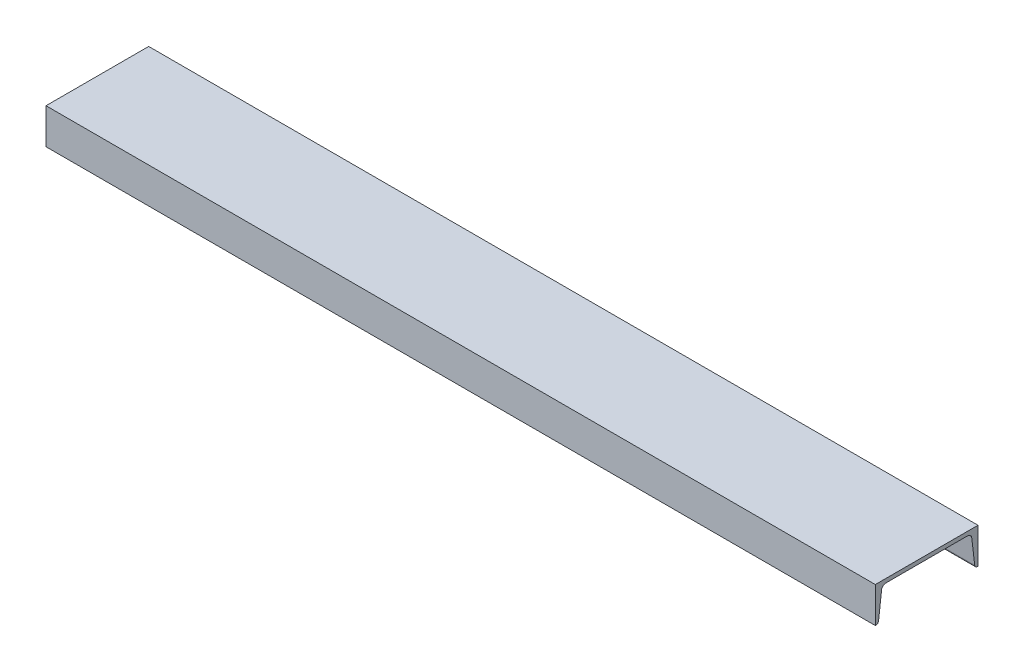
ISO-10303-21;
HEADER;
FILE_DESCRIPTION(('STEP AP214'),'2;1');
FILE_NAME('part.step','',(''),(''),'','','');
FILE_SCHEMA(('AUTOMOTIVE_DESIGN { 1 0 10303 214 1 1 1 1 }'));
ENDSEC;
DATA;
#1=APPLICATION_CONTEXT('core data for automotive mechanical design processes');
#2=APPLICATION_PROTOCOL_DEFINITION('international standard','automotive_design',2000,#1);
#3=PRODUCT_CONTEXT('',#1,'mechanical');
#4=PRODUCT('Part','Part','',(#3));
#5=PRODUCT_RELATED_PRODUCT_CATEGORY('part','',(#4));
#6=PRODUCT_DEFINITION_FORMATION('','',#4);
#7=PRODUCT_DEFINITION_CONTEXT('part definition',#1,'design');
#8=PRODUCT_DEFINITION('design','',#6,#7);
#9=PRODUCT_DEFINITION_SHAPE('','',#8);
#10=(LENGTH_UNIT() NAMED_UNIT(*) SI_UNIT(.MILLI.,.METRE.));
#11=(NAMED_UNIT(*) PLANE_ANGLE_UNIT() SI_UNIT($,.RADIAN.));
#12=(NAMED_UNIT(*) SI_UNIT($,.STERADIAN.) SOLID_ANGLE_UNIT());
#13=UNCERTAINTY_MEASURE_WITH_UNIT(LENGTH_MEASURE(1.E-05),#10,'distance_accuracy_value','');
#14=(GEOMETRIC_REPRESENTATION_CONTEXT(3) GLOBAL_UNCERTAINTY_ASSIGNED_CONTEXT((#13)) GLOBAL_UNIT_ASSIGNED_CONTEXT((#10,
#11,#12)) REPRESENTATION_CONTEXT('',''));
#15=CARTESIAN_POINT('',(0.,0.,0.));
#16=DIRECTION('',(0.,0.,1.));
#17=DIRECTION('',(1.,0.,0.));
#18=AXIS2_PLACEMENT_3D('',#15,#16,#17);
#19=CARTESIAN_POINT('',(2100.,0.,-130.));
#20=DIRECTION('',(0.,0.,-1.));
#21=DIRECTION('',(-1.,0.,0.));
#22=AXIS2_PLACEMENT_3D('',#19,#20,#21);
#23=PLANE('',#22);
#24=DIRECTION('',(0.,-1.,0.));
#25=VECTOR('',#24,1.);
#26=CARTESIAN_POINT('',(0.,0.,-130.));
#27=LINE('',#26,#25);
#28=CARTESIAN_POINT('',(0.,0.,-130.));
#29=VERTEX_POINT('',#28);
#30=CARTESIAN_POINT('',(0.,-90.,-130.));
#31=VERTEX_POINT('',#30);
#32=EDGE_CURVE('E157',#29,#31,#27,.T.);
#33=ORIENTED_EDGE('',*,*,#32,.F.);
#34=DIRECTION('',(-1.,0.,0.));
#35=VECTOR('',#34,1.);
#36=CARTESIAN_POINT('',(2100.,0.,-130.));
#37=LINE('',#36,#35);
#38=CARTESIAN_POINT('',(2100.,0.,-130.));
#39=VERTEX_POINT('',#38);
#40=EDGE_CURVE('E11',#39,#29,#37,.T.);
#41=ORIENTED_EDGE('',*,*,#40,.F.);
#42=DIRECTION('',(0.,-1.,0.));
#43=VECTOR('',#42,1.);
#44=CARTESIAN_POINT('',(2100.,0.,-130.));
#45=LINE('',#44,#43);
#46=CARTESIAN_POINT('',(2100.,-90.,-130.));
#47=VERTEX_POINT('',#46);
#48=EDGE_CURVE('E186',#39,#47,#45,.T.);
#49=ORIENTED_EDGE('',*,*,#48,.T.);
#50=DIRECTION('',(-1.,0.,0.));
#51=VECTOR('',#50,1.);
#52=CARTESIAN_POINT('',(2100.,-90.,-130.));
#53=LINE('',#52,#51);
#54=EDGE_CURVE('E38',#47,#31,#53,.T.);
#55=ORIENTED_EDGE('',*,*,#54,.T.);
#56=EDGE_LOOP('',(#33,#41,#49,#55));
#57=FACE_BOUND('',#56,.T.);
#58=ADVANCED_FACE('F35',(#57),#23,.T.);
#59=CARTESIAN_POINT('',(2100.,0.,-130.));
#60=DIRECTION('',(0.,-1.,0.));
#61=DIRECTION('',(0.,0.,-1.));
#62=AXIS2_PLACEMENT_3D('',#59,#60,#61);
#63=PLANE('',#62);
#64=DIRECTION('',(0.,0.,1.));
#65=VECTOR('',#64,1.);
#66=CARTESIAN_POINT('',(0.,0.,-130.));
#67=LINE('',#66,#65);
#68=CARTESIAN_POINT('',(0.,0.,130.));
#69=VERTEX_POINT('',#68);
#70=EDGE_CURVE('E92',#29,#69,#67,.T.);
#71=ORIENTED_EDGE('',*,*,#70,.T.);
#72=DIRECTION('',(-1.,0.,0.));
#73=VECTOR('',#72,1.);
#74=CARTESIAN_POINT('',(2100.,0.,130.));
#75=LINE('',#74,#73);
#76=CARTESIAN_POINT('',(2100.,0.,130.));
#77=VERTEX_POINT('',#76);
#78=EDGE_CURVE('E44',#77,#69,#75,.T.);
#79=ORIENTED_EDGE('',*,*,#78,.F.);
#80=DIRECTION('',(0.,0.,1.));
#81=VECTOR('',#80,1.);
#82=CARTESIAN_POINT('',(2100.,0.,-130.));
#83=LINE('',#82,#81);
#84=EDGE_CURVE('E135',#39,#77,#83,.T.);
#85=ORIENTED_EDGE('',*,*,#84,.F.);
#86=ORIENTED_EDGE('',*,*,#40,.T.);
#87=EDGE_LOOP('',(#71,#79,#85,#86));
#88=FACE_BOUND('',#87,.T.);
#89=ADVANCED_FACE('F262',(#88),#63,.F.);
#90=CARTESIAN_POINT('',(2100.,0.,130.));
#91=DIRECTION('',(0.,0.,-1.));
#92=DIRECTION('',(-1.,0.,0.));
#93=AXIS2_PLACEMENT_3D('',#90,#91,#92);
#94=PLANE('',#93);
#95=DIRECTION('',(0.,-1.,0.));
#96=VECTOR('',#95,1.);
#97=CARTESIAN_POINT('',(0.,0.,130.));
#98=LINE('',#97,#96);
#99=CARTESIAN_POINT('',(0.,-90.,130.));
#100=VERTEX_POINT('',#99);
#101=EDGE_CURVE('E142',#69,#100,#98,.T.);
#102=ORIENTED_EDGE('',*,*,#101,.T.);
#103=DIRECTION('',(-1.,0.,0.));
#104=VECTOR('',#103,1.);
#105=CARTESIAN_POINT('',(2100.,-90.,130.));
#106=LINE('',#105,#104);
#107=CARTESIAN_POINT('',(2100.,-90.,130.));
#108=VERTEX_POINT('',#107);
#109=EDGE_CURVE('E139',#108,#100,#106,.T.);
#110=ORIENTED_EDGE('',*,*,#109,.F.);
#111=DIRECTION('',(0.,-1.,0.));
#112=VECTOR('',#111,1.);
#113=CARTESIAN_POINT('',(2100.,0.,130.));
#114=LINE('',#113,#112);
#115=EDGE_CURVE('E128',#77,#108,#114,.T.);
#116=ORIENTED_EDGE('',*,*,#115,.F.);
#117=ORIENTED_EDGE('',*,*,#78,.T.);
#118=EDGE_LOOP('',(#102,#110,#116,#117));
#119=FACE_BOUND('',#118,.T.);
#120=ADVANCED_FACE('F140',(#119),#94,.F.);
#121=CARTESIAN_POINT('',(2100.,-90.,130.));
#122=DIRECTION('',(0.,1.,0.));
#123=DIRECTION('',(0.,0.,1.));
#124=AXIS2_PLACEMENT_3D('',#121,#122,#123);
#125=PLANE('',#124);
#126=DIRECTION('',(0.,0.,-1.));
#127=VECTOR('',#126,1.);
#128=CARTESIAN_POINT('',(0.,-90.,130.));
#129=LINE('',#128,#127);
#130=CARTESIAN_POINT('',(0.,-90.,128.678333405021));
#131=VERTEX_POINT('',#130);
#132=EDGE_CURVE('E183',#100,#131,#129,.T.);
#133=ORIENTED_EDGE('',*,*,#132,.T.);
#134=DIRECTION('',(-1.,0.,0.));
#135=VECTOR('',#134,1.);
#136=CARTESIAN_POINT('',(2100.,-90.,128.678333405021));
#137=LINE('',#136,#135);
#138=CARTESIAN_POINT('',(2100.,-90.,128.678333405021));
#139=VERTEX_POINT('',#138);
#140=EDGE_CURVE('E145',#139,#131,#137,.T.);
#141=ORIENTED_EDGE('',*,*,#140,.F.);
#142=DIRECTION('',(0.,0.,-1.));
#143=VECTOR('',#142,1.);
#144=CARTESIAN_POINT('',(2100.,-90.,130.));
#145=LINE('',#144,#143);
#146=EDGE_CURVE('E133',#108,#139,#145,.T.);
#147=ORIENTED_EDGE('',*,*,#146,.F.);
#148=ORIENTED_EDGE('',*,*,#109,.T.);
#149=EDGE_LOOP('',(#133,#141,#147,#148));
#150=FACE_BOUND('',#149,.T.);
#151=ADVANCED_FACE('F147',(#150),#125,.F.);
#152=CARTESIAN_POINT('',(2100.,-83.,128.678333405021));
#153=DIRECTION('',(-1.,0.,0.));
#154=DIRECTION('',(0.,0.,1.));
#155=AXIS2_PLACEMENT_3D('',#152,#153,#154);
#156=CYLINDRICAL_SURFACE('',#155,7.00000000000001);
#157=CARTESIAN_POINT('',(0.,-83.,128.678333405021));
#158=DIRECTION('',(1.,0.,0.));
#159=DIRECTION('',(0.,0.,-1.));
#160=AXIS2_PLACEMENT_3D('',#157,#158,#159);
#161=CIRCLE('',#160,7.00000000000001);
#162=CARTESIAN_POINT('',(0.,-83.8216184771156,121.726718982597));
#163=VERTEX_POINT('',#162);
#164=EDGE_CURVE('E180',#131,#163,#161,.T.);
#165=ORIENTED_EDGE('',*,*,#164,.T.);
#166=DIRECTION('',(-1.,0.,0.));
#167=VECTOR('',#166,1.);
#168=CARTESIAN_POINT('',(2100.,-83.8216184771156,121.726718982597));
#169=LINE('',#168,#167);
#170=CARTESIAN_POINT('',(2100.,-83.8216184771156,121.726718982597));
#171=VERTEX_POINT('',#170);
#172=EDGE_CURVE('E190',#171,#163,#169,.T.);
#173=ORIENTED_EDGE('',*,*,#172,.F.);
#174=CARTESIAN_POINT('',(2100.,-83.,128.678333405021));
#175=DIRECTION('',(1.,0.,0.));
#176=DIRECTION('',(0.,0.,-1.));
#177=AXIS2_PLACEMENT_3D('',#174,#175,#176);
#178=CIRCLE('',#177,7.00000000000001);
#179=EDGE_CURVE('E150',#139,#171,#178,.T.);
#180=ORIENTED_EDGE('',*,*,#179,.F.);
#181=ORIENTED_EDGE('',*,*,#140,.T.);
#182=EDGE_LOOP('',(#165,#173,#180,#181));
#183=FACE_BOUND('',#182,.T.);
#184=ADVANCED_FACE('F209',(#183),#156,.T.);
#185=CARTESIAN_POINT('',(2100.,-16.7206222894941,113.795983048398));
#186=DIRECTION('',(0.,-0.117374068159373,-0.993087774632091));
#187=DIRECTION('',(0.,0.993087774632091,-0.117374068159373));
#188=AXIS2_PLACEMENT_3D('',#185,#186,#187);
#189=PLANE('',#188);
#190=DIRECTION('',(0.,-0.993087774632091,0.117374068159373));
#191=VECTOR('',#190,1.);
#192=CARTESIAN_POINT('',(0.,-16.7206222894941,113.795983048398));
#193=LINE('',#192,#191);
#194=CARTESIAN_POINT('',(0.,-16.7206222894941,113.795983048398));
#195=VERTEX_POINT('',#194);
#196=EDGE_CURVE('E177',#195,#163,#193,.T.);
#197=ORIENTED_EDGE('',*,*,#196,.F.);
#198=DIRECTION('',(-1.,0.,0.));
#199=VECTOR('',#198,1.);
#200=CARTESIAN_POINT('',(2100.,-16.7206222894941,113.795983048398));
#201=LINE('',#200,#199);
#202=CARTESIAN_POINT('',(2100.,-16.7206222894941,113.795983048398));
#203=VERTEX_POINT('',#202);
#204=EDGE_CURVE('E192',#203,#195,#201,.T.);
#205=ORIENTED_EDGE('',*,*,#204,.F.);
#206=DIRECTION('',(0.,-0.993087774632091,0.117374068159373));
#207=VECTOR('',#206,1.);
#208=CARTESIAN_POINT('',(2100.,-16.7206222894941,113.795983048398));
#209=LINE('',#208,#207);
#210=EDGE_CURVE('E152',#203,#171,#209,.T.);
#211=ORIENTED_EDGE('',*,*,#210,.T.);
#212=ORIENTED_EDGE('',*,*,#172,.T.);
#213=EDGE_LOOP('',(#197,#205,#211,#212));
#214=FACE_BOUND('',#213,.T.);
#215=ADVANCED_FACE('F252',(#214),#189,.T.);
#216=CARTESIAN_POINT('',(2100.,-24.,101.837276590433));
#217=DIRECTION('',(-1.,0.,0.));
#218=DIRECTION('',(0.,0.,1.));
#219=AXIS2_PLACEMENT_3D('',#216,#217,#218);
#220=CYLINDRICAL_SURFACE('',#219,14.);
#221=CARTESIAN_POINT('',(0.,-24.,101.837276590433));
#222=DIRECTION('',(1.,0.,0.));
#223=DIRECTION('',(0.,0.,-1.));
#224=AXIS2_PLACEMENT_3D('',#221,#222,#223);
#225=CIRCLE('',#224,14.);
#226=CARTESIAN_POINT('',(0.,-10.,101.837276590433));
#227=VERTEX_POINT('',#226);
#228=EDGE_CURVE('E174',#227,#195,#225,.T.);
#229=ORIENTED_EDGE('',*,*,#228,.F.);
#230=DIRECTION('',(-1.,0.,0.));
#231=VECTOR('',#230,1.);
#232=CARTESIAN_POINT('',(2100.,-10.,101.837276590433));
#233=LINE('',#232,#231);
#234=CARTESIAN_POINT('',(2100.,-10.,101.837276590433));
#235=VERTEX_POINT('',#234);
#236=EDGE_CURVE('E194',#235,#227,#233,.T.);
#237=ORIENTED_EDGE('',*,*,#236,.F.);
#238=CARTESIAN_POINT('',(2100.,-24.,101.837276590433));
#239=DIRECTION('',(1.,0.,0.));
#240=DIRECTION('',(0.,0.,-1.));
#241=AXIS2_PLACEMENT_3D('',#238,#239,#240);
#242=CIRCLE('',#241,14.);
#243=EDGE_CURVE('E216',#235,#203,#242,.T.);
#244=ORIENTED_EDGE('',*,*,#243,.T.);
#245=ORIENTED_EDGE('',*,*,#204,.T.);
#246=EDGE_LOOP('',(#229,#237,#244,#245));
#247=FACE_BOUND('',#246,.T.);
#248=ADVANCED_FACE('F221',(#247),#220,.F.);
#249=CARTESIAN_POINT('',(2100.,-9.99999999999998,-101.837276590433));
#250=DIRECTION('',(0.,-1.,0.));
#251=DIRECTION('',(0.,0.,-1.));
#252=AXIS2_PLACEMENT_3D('',#249,#250,#251);
#253=PLANE('',#252);
#254=DIRECTION('',(0.,0.,1.));
#255=VECTOR('',#254,1.);
#256=CARTESIAN_POINT('',(0.,-9.99999999999998,-101.837276590433));
#257=LINE('',#256,#255);
#258=CARTESIAN_POINT('',(0.,-9.99999999999998,-101.837276590433));
#259=VERTEX_POINT('',#258);
#260=EDGE_CURVE('E171',#259,#227,#257,.T.);
#261=ORIENTED_EDGE('',*,*,#260,.F.);
#262=DIRECTION('',(-1.,0.,0.));
#263=VECTOR('',#262,1.);
#264=CARTESIAN_POINT('',(2100.,-9.99999999999998,-101.837276590433));
#265=LINE('',#264,#263);
#266=CARTESIAN_POINT('',(2100.,-9.99999999999998,-101.837276590433));
#267=VERTEX_POINT('',#266);
#268=EDGE_CURVE('E196',#267,#259,#265,.T.);
#269=ORIENTED_EDGE('',*,*,#268,.F.);
#270=DIRECTION('',(0.,0.,1.));
#271=VECTOR('',#270,1.);
#272=CARTESIAN_POINT('',(2100.,-9.99999999999998,-101.837276590433));
#273=LINE('',#272,#271);
#274=EDGE_CURVE('E223',#267,#235,#273,.T.);
#275=ORIENTED_EDGE('',*,*,#274,.T.);
#276=ORIENTED_EDGE('',*,*,#236,.T.);
#277=EDGE_LOOP('',(#261,#269,#275,#276));
#278=FACE_BOUND('',#277,.T.);
#279=ADVANCED_FACE('F251',(#278),#253,.T.);
#280=CARTESIAN_POINT('',(2100.,-24.,-101.837276590433));
#281=DIRECTION('',(-1.,0.,0.));
#282=DIRECTION('',(0.,0.,1.));
#283=AXIS2_PLACEMENT_3D('',#280,#281,#282);
#284=CYLINDRICAL_SURFACE('',#283,14.);
#285=CARTESIAN_POINT('',(0.,-24.,-101.837276590433));
#286=DIRECTION('',(-1.,0.,0.));
#287=DIRECTION('',(0.,0.,1.));
#288=AXIS2_PLACEMENT_3D('',#285,#286,#287);
#289=CIRCLE('',#288,14.);
#290=CARTESIAN_POINT('',(0.,-16.7206222894941,-113.795983048398));
#291=VERTEX_POINT('',#290);
#292=EDGE_CURVE('E169',#259,#291,#289,.T.);
#293=ORIENTED_EDGE('',*,*,#292,.T.);
#294=DIRECTION('',(-1.,0.,0.));
#295=VECTOR('',#294,1.);
#296=CARTESIAN_POINT('',(2100.,-16.7206222894941,-113.795983048398));
#297=LINE('',#296,#295);
#298=CARTESIAN_POINT('',(2100.,-16.7206222894941,-113.795983048398));
#299=VERTEX_POINT('',#298);
#300=EDGE_CURVE('E198',#299,#291,#297,.T.);
#301=ORIENTED_EDGE('',*,*,#300,.F.);
#302=CARTESIAN_POINT('',(2100.,-24.,-101.837276590433));
#303=DIRECTION('',(-1.,0.,0.));
#304=DIRECTION('',(0.,0.,1.));
#305=AXIS2_PLACEMENT_3D('',#302,#303,#304);
#306=CIRCLE('',#305,14.);
#307=EDGE_CURVE('E225',#267,#299,#306,.T.);
#308=ORIENTED_EDGE('',*,*,#307,.F.);
#309=ORIENTED_EDGE('',*,*,#268,.T.);
#310=EDGE_LOOP('',(#293,#301,#308,#309));
#311=FACE_BOUND('',#310,.T.);
#312=ADVANCED_FACE('F249',(#311),#284,.F.);
#313=CARTESIAN_POINT('',(2100.,-16.7206222894941,-113.795983048398));
#314=DIRECTION('',(0.,0.117374068159373,-0.993087774632091));
#315=DIRECTION('',(0.,0.993087774632091,0.117374068159373));
#316=AXIS2_PLACEMENT_3D('',#313,#314,#315);
#317=PLANE('',#316);
#318=DIRECTION('',(0.,-0.993087774632091,-0.117374068159373));
#319=VECTOR('',#318,1.);
#320=CARTESIAN_POINT('',(0.,-16.7206222894941,-113.795983048398));
#321=LINE('',#320,#319);
#322=CARTESIAN_POINT('',(0.,-83.8216184771156,-121.726718982597));
#323=VERTEX_POINT('',#322);
#324=EDGE_CURVE('E166',#291,#323,#321,.T.);
#325=ORIENTED_EDGE('',*,*,#324,.T.);
#326=DIRECTION('',(-1.,0.,0.));
#327=VECTOR('',#326,1.);
#328=CARTESIAN_POINT('',(2100.,-83.8216184771156,-121.726718982597));
#329=LINE('',#328,#327);
#330=CARTESIAN_POINT('',(2100.,-83.8216184771156,-121.726718982597));
#331=VERTEX_POINT('',#330);
#332=EDGE_CURVE('E201',#331,#323,#329,.T.);
#333=ORIENTED_EDGE('',*,*,#332,.F.);
#334=DIRECTION('',(0.,-0.993087774632091,-0.117374068159373));
#335=VECTOR('',#334,1.);
#336=CARTESIAN_POINT('',(2100.,-16.7206222894941,-113.795983048398));
#337=LINE('',#336,#335);
#338=EDGE_CURVE('E229',#299,#331,#337,.T.);
#339=ORIENTED_EDGE('',*,*,#338,.F.);
#340=ORIENTED_EDGE('',*,*,#300,.T.);
#341=EDGE_LOOP('',(#325,#333,#339,#340));
#342=FACE_BOUND('',#341,.T.);
#343=ADVANCED_FACE('F245',(#342),#317,.F.);
#344=CARTESIAN_POINT('',(2100.,-83.,-128.678333405021));
#345=DIRECTION('',(-1.,0.,0.));
#346=DIRECTION('',(0.,0.,1.));
#347=AXIS2_PLACEMENT_3D('',#344,#345,#346);
#348=CYLINDRICAL_SURFACE('',#347,6.99999999999999);
#349=CARTESIAN_POINT('',(0.,-83.,-128.678333405021));
#350=DIRECTION('',(-1.,0.,0.));
#351=DIRECTION('',(0.,0.,1.));
#352=AXIS2_PLACEMENT_3D('',#349,#350,#351);
#353=CIRCLE('',#352,6.99999999999999);
#354=CARTESIAN_POINT('',(0.,-90.,-128.678333405021));
#355=VERTEX_POINT('',#354);
#356=EDGE_CURVE('E163',#355,#323,#353,.T.);
#357=ORIENTED_EDGE('',*,*,#356,.F.);
#358=DIRECTION('',(-1.,0.,0.));
#359=VECTOR('',#358,1.);
#360=CARTESIAN_POINT('',(2100.,-90.,-128.678333405021));
#361=LINE('',#360,#359);
#362=CARTESIAN_POINT('',(2100.,-90.,-128.678333405021));
#363=VERTEX_POINT('',#362);
#364=EDGE_CURVE('E202',#363,#355,#361,.T.);
#365=ORIENTED_EDGE('',*,*,#364,.F.);
#366=CARTESIAN_POINT('',(2100.,-83.,-128.678333405021));
#367=DIRECTION('',(-1.,0.,0.));
#368=DIRECTION('',(0.,0.,1.));
#369=AXIS2_PLACEMENT_3D('',#366,#367,#368);
#370=CIRCLE('',#369,6.99999999999999);
#371=EDGE_CURVE('E231',#363,#331,#370,.T.);
#372=ORIENTED_EDGE('',*,*,#371,.T.);
#373=ORIENTED_EDGE('',*,*,#332,.T.);
#374=EDGE_LOOP('',(#357,#365,#372,#373));
#375=FACE_BOUND('',#374,.T.);
#376=ADVANCED_FACE('F240',(#375),#348,.T.);
#377=CARTESIAN_POINT('',(2100.,-90.,-130.));
#378=DIRECTION('',(0.,-1.,0.));
#379=DIRECTION('',(0.,0.,-1.));
#380=AXIS2_PLACEMENT_3D('',#377,#378,#379);
#381=PLANE('',#380);
#382=DIRECTION('',(0.,0.,1.));
#383=VECTOR('',#382,1.);
#384=CARTESIAN_POINT('',(0.,-90.,-130.));
#385=LINE('',#384,#383);
#386=EDGE_CURVE('E160',#31,#355,#385,.T.);
#387=ORIENTED_EDGE('',*,*,#386,.F.);
#388=ORIENTED_EDGE('',*,*,#54,.F.);
#389=DIRECTION('',(0.,0.,1.));
#390=VECTOR('',#389,1.);
#391=CARTESIAN_POINT('',(2100.,-90.,-130.));
#392=LINE('',#391,#390);
#393=EDGE_CURVE('E234',#47,#363,#392,.T.);
#394=ORIENTED_EDGE('',*,*,#393,.T.);
#395=ORIENTED_EDGE('',*,*,#364,.T.);
#396=EDGE_LOOP('',(#387,#388,#394,#395));
#397=FACE_BOUND('',#396,.T.);
#398=ADVANCED_FACE('F204',(#397),#381,.T.);
#399=CARTESIAN_POINT('',(2100.,-83.,-128.678333405021));
#400=DIRECTION('',(-1.,0.,0.));
#401=DIRECTION('',(0.,0.,1.));
#402=AXIS2_PLACEMENT_3D('',#399,#400,#401);
#403=PLANE('',#402);
#404=ORIENTED_EDGE('',*,*,#48,.F.);
#405=ORIENTED_EDGE('',*,*,#84,.T.);
#406=ORIENTED_EDGE('',*,*,#115,.T.);
#407=ORIENTED_EDGE('',*,*,#146,.T.);
#408=ORIENTED_EDGE('',*,*,#179,.T.);
#409=ORIENTED_EDGE('',*,*,#210,.F.);
#410=ORIENTED_EDGE('',*,*,#243,.F.);
#411=ORIENTED_EDGE('',*,*,#274,.F.);
#412=ORIENTED_EDGE('',*,*,#307,.T.);
#413=ORIENTED_EDGE('',*,*,#338,.T.);
#414=ORIENTED_EDGE('',*,*,#371,.F.);
#415=ORIENTED_EDGE('',*,*,#393,.F.);
#416=EDGE_LOOP('',(#404,#405,#406,#407,#408,#409,#410,#411,#412,#413,#414,#415));
#417=FACE_BOUND('',#416,.T.);
#418=ADVANCED_FACE('F131',(#417),#403,.F.);
#419=CARTESIAN_POINT('',(0.,-83.,-128.678333405021));
#420=DIRECTION('',(-1.,0.,0.));
#421=DIRECTION('',(0.,0.,1.));
#422=AXIS2_PLACEMENT_3D('',#419,#420,#421);
#423=PLANE('',#422);
#424=ORIENTED_EDGE('',*,*,#32,.T.);
#425=ORIENTED_EDGE('',*,*,#386,.T.);
#426=ORIENTED_EDGE('',*,*,#356,.T.);
#427=ORIENTED_EDGE('',*,*,#324,.F.);
#428=ORIENTED_EDGE('',*,*,#292,.F.);
#429=ORIENTED_EDGE('',*,*,#260,.T.);
#430=ORIENTED_EDGE('',*,*,#228,.T.);
#431=ORIENTED_EDGE('',*,*,#196,.T.);
#432=ORIENTED_EDGE('',*,*,#164,.F.);
#433=ORIENTED_EDGE('',*,*,#132,.F.);
#434=ORIENTED_EDGE('',*,*,#101,.F.);
#435=ORIENTED_EDGE('',*,*,#70,.F.);
#436=EDGE_LOOP('',(#424,#425,#426,#427,#428,#429,#430,#431,#432,#433,#434,#435));
#437=FACE_BOUND('',#436,.T.);
#438=ADVANCED_FACE('F206',(#437),#423,.T.);
#439=CLOSED_SHELL('',(#58,#89,#120,#151,#184,#215,#248,#279,#312,#343,#376,#398,#418,#438));
#440=MANIFOLD_SOLID_BREP('B2',#439);
#441=ADVANCED_BREP_SHAPE_REPRESENTATION('',(#18,#440),#14);
#442=SHAPE_DEFINITION_REPRESENTATION(#9,#441);
ENDSEC;
END-ISO-10303-21;
